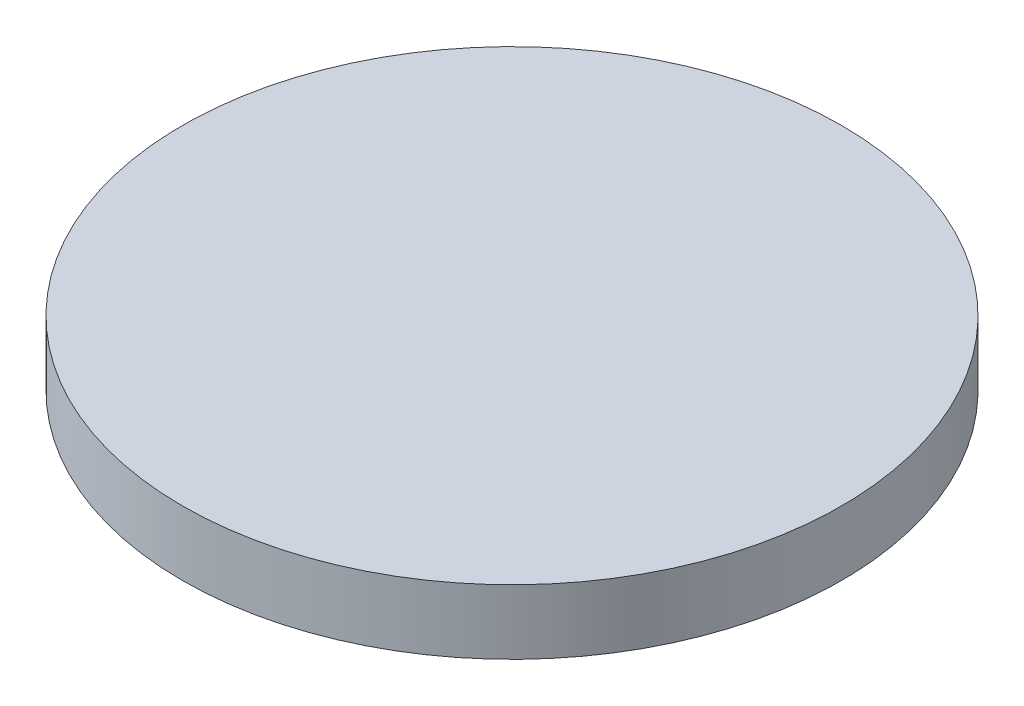
ISO-10303-21;
HEADER;
FILE_DESCRIPTION(('STEP AP214'),'2;1');
FILE_NAME('part.step','',(''),(''),'','','');
FILE_SCHEMA(('AUTOMOTIVE_DESIGN { 1 0 10303 214 1 1 1 1 }'));
ENDSEC;
DATA;
#1=APPLICATION_CONTEXT('core data for automotive mechanical design processes');
#2=APPLICATION_PROTOCOL_DEFINITION('international standard','automotive_design',2000,#1);
#3=PRODUCT_CONTEXT('',#1,'mechanical');
#4=PRODUCT('Part','Part','',(#3));
#5=PRODUCT_RELATED_PRODUCT_CATEGORY('part','',(#4));
#6=PRODUCT_DEFINITION_FORMATION('','',#4);
#7=PRODUCT_DEFINITION_CONTEXT('part definition',#1,'design');
#8=PRODUCT_DEFINITION('design','',#6,#7);
#9=PRODUCT_DEFINITION_SHAPE('','',#8);
#10=(LENGTH_UNIT() NAMED_UNIT(*) SI_UNIT(.MILLI.,.METRE.));
#11=(NAMED_UNIT(*) PLANE_ANGLE_UNIT() SI_UNIT($,.RADIAN.));
#12=(NAMED_UNIT(*) SI_UNIT($,.STERADIAN.) SOLID_ANGLE_UNIT());
#13=UNCERTAINTY_MEASURE_WITH_UNIT(LENGTH_MEASURE(1.E-05),#10,'distance_accuracy_value','');
#14=(GEOMETRIC_REPRESENTATION_CONTEXT(3) GLOBAL_UNCERTAINTY_ASSIGNED_CONTEXT((#13)) GLOBAL_UNIT_ASSIGNED_CONTEXT((#10,
#11,#12)) REPRESENTATION_CONTEXT('',''));
#15=CARTESIAN_POINT('',(0.,0.,0.));
#16=DIRECTION('',(0.,0.,1.));
#17=DIRECTION('',(1.,0.,0.));
#18=AXIS2_PLACEMENT_3D('',#15,#16,#17);
#19=CARTESIAN_POINT('',(0.,5.,0.));
#20=DIRECTION('',(0.,-1.,0.));
#21=DIRECTION('',(0.,0.,-1.));
#22=AXIS2_PLACEMENT_3D('',#19,#20,#21);
#23=CYLINDRICAL_SURFACE('',#22,25.5);
#24=CARTESIAN_POINT('',(0.,5.,0.));
#25=DIRECTION('',(0.,1.,0.));
#26=DIRECTION('',(0.,0.,1.));
#27=AXIS2_PLACEMENT_3D('',#24,#25,#26);
#28=CIRCLE('',#27,25.5);
#29=CARTESIAN_POINT('',(0.,5.,25.5));
#30=VERTEX_POINT('',#29);
#31=EDGE_CURVE('E10',#30,#30,#28,.T.);
#32=ORIENTED_EDGE('',*,*,#31,.F.);
#33=EDGE_LOOP('',(#32));
#34=FACE_BOUND('',#33,.T.);
#35=CARTESIAN_POINT('',(0.,0.,0.));
#36=DIRECTION('',(0.,1.,0.));
#37=DIRECTION('',(0.,0.,1.));
#38=AXIS2_PLACEMENT_3D('',#35,#36,#37);
#39=CIRCLE('',#38,25.5);
#40=CARTESIAN_POINT('',(0.,0.,25.5));
#41=VERTEX_POINT('',#40);
#42=EDGE_CURVE('E34',#41,#41,#39,.T.);
#43=ORIENTED_EDGE('',*,*,#42,.T.);
#44=EDGE_LOOP('',(#43));
#45=FACE_BOUND('',#44,.T.);
#46=ADVANCED_FACE('F31',(#34,#45),#23,.T.);
#47=CARTESIAN_POINT('',(0.,5.,0.));
#48=DIRECTION('',(0.,1.,0.));
#49=DIRECTION('',(0.,0.,1.));
#50=AXIS2_PLACEMENT_3D('',#47,#48,#49);
#51=PLANE('',#50);
#52=ORIENTED_EDGE('',*,*,#31,.T.);
#53=EDGE_LOOP('',(#52));
#54=FACE_BOUND('',#53,.T.);
#55=ADVANCED_FACE('F46',(#54),#51,.T.);
#56=CARTESIAN_POINT('',(0.,0.,0.));
#57=DIRECTION('',(0.,1.,0.));
#58=DIRECTION('',(0.,0.,1.));
#59=AXIS2_PLACEMENT_3D('',#56,#57,#58);
#60=PLANE('',#59);
#61=ORIENTED_EDGE('',*,*,#42,.F.);
#62=EDGE_LOOP('',(#61));
#63=FACE_BOUND('',#62,.T.);
#64=ADVANCED_FACE('F44',(#63),#60,.F.);
#65=CLOSED_SHELL('',(#46,#55,#64));
#66=MANIFOLD_SOLID_BREP('B2',#65);
#67=ADVANCED_BREP_SHAPE_REPRESENTATION('',(#18,#66),#14);
#68=SHAPE_DEFINITION_REPRESENTATION(#9,#67);
ENDSEC;
END-ISO-10303-21;
